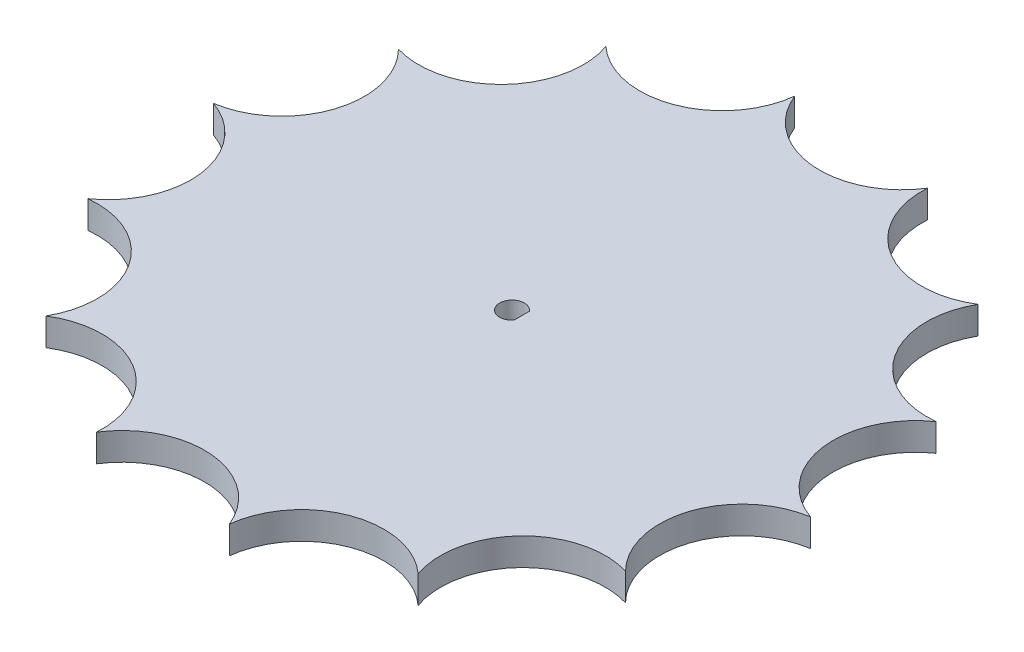
ISO-10303-21;
HEADER;
FILE_DESCRIPTION(('STEP AP214'),'2;1');
FILE_NAME('part.step','',(''),(''),'','','');
FILE_SCHEMA(('AUTOMOTIVE_DESIGN { 1 0 10303 214 1 1 1 1 }'));
ENDSEC;
DATA;
#1=APPLICATION_CONTEXT('core data for automotive mechanical design processes');
#2=APPLICATION_PROTOCOL_DEFINITION('international standard','automotive_design',2000,#1);
#3=PRODUCT_CONTEXT('',#1,'mechanical');
#4=PRODUCT('Part','Part','',(#3));
#5=PRODUCT_RELATED_PRODUCT_CATEGORY('part','',(#4));
#6=PRODUCT_DEFINITION_FORMATION('','',#4);
#7=PRODUCT_DEFINITION_CONTEXT('part definition',#1,'design');
#8=PRODUCT_DEFINITION('design','',#6,#7);
#9=PRODUCT_DEFINITION_SHAPE('','',#8);
#10=(LENGTH_UNIT() NAMED_UNIT(*) SI_UNIT(.MILLI.,.METRE.));
#11=(NAMED_UNIT(*) PLANE_ANGLE_UNIT() SI_UNIT($,.RADIAN.));
#12=(NAMED_UNIT(*) SI_UNIT($,.STERADIAN.) SOLID_ANGLE_UNIT());
#13=UNCERTAINTY_MEASURE_WITH_UNIT(LENGTH_MEASURE(1.E-05),#10,'distance_accuracy_value','');
#14=(GEOMETRIC_REPRESENTATION_CONTEXT(3) GLOBAL_UNCERTAINTY_ASSIGNED_CONTEXT((#13)) GLOBAL_UNIT_ASSIGNED_CONTEXT((#10,
#11,#12)) REPRESENTATION_CONTEXT('',''));
#15=CARTESIAN_POINT('',(0.,0.,0.));
#16=DIRECTION('',(0.,0.,1.));
#17=DIRECTION('',(1.,0.,0.));
#18=AXIS2_PLACEMENT_3D('',#15,#16,#17);
#19=CARTESIAN_POINT('',(0.,0.,0.));
#20=DIRECTION('',(0.,1.,0.));
#21=DIRECTION('',(0.,0.,1.));
#22=AXIS2_PLACEMENT_3D('',#19,#20,#21);
#23=PLANE('',#22);
#24=CARTESIAN_POINT('',(0.,0.,0.));
#25=DIRECTION('',(0.,1.,0.));
#26=DIRECTION('',(0.,0.,1.));
#27=AXIS2_PLACEMENT_3D('',#24,#25,#26);
#28=CIRCLE('',#27,8.255);
#29=CARTESIAN_POINT('',(0.,0.,8.255));
#30=VERTEX_POINT('',#29);
#31=EDGE_CURVE('E51',#30,#30,#28,.T.);
#32=ORIENTED_EDGE('',*,*,#31,.F.);
#33=EDGE_LOOP('',(#32));
#34=FACE_BOUND('',#33,.T.);
#35=CARTESIAN_POINT('',(0.,0.,0.));
#36=DIRECTION('',(0.,1.,0.));
#37=DIRECTION('',(0.,0.,1.));
#38=AXIS2_PLACEMENT_3D('',#35,#36,#37);
#39=CIRCLE('',#38,2.85749999999999);
#40=CARTESIAN_POINT('',(2.23696719913368,0.,-1.778));
#41=VERTEX_POINT('',#40);
#42=CARTESIAN_POINT('',(2.23696719913368,0.,1.778));
#43=VERTEX_POINT('',#42);
#44=EDGE_CURVE('E63',#41,#43,#39,.T.);
#45=ORIENTED_EDGE('',*,*,#44,.T.);
#46=DIRECTION('',(0.,0.,-1.));
#47=VECTOR('',#46,1.);
#48=CARTESIAN_POINT('',(2.23696719913368,0.,1.778));
#49=LINE('',#48,#47);
#50=EDGE_CURVE('E70',#43,#41,#49,.T.);
#51=ORIENTED_EDGE('',*,*,#50,.T.);
#52=EDGE_LOOP('',(#45,#51));
#53=FACE_BOUND('',#52,.T.);
#54=ADVANCED_FACE('F47',(#34,#53),#23,.F.);
#55=CARTESIAN_POINT('',(0.,4.572,0.));
#56=DIRECTION('',(0.,-1.,0.));
#57=DIRECTION('',(0.,0.,-1.));
#58=AXIS2_PLACEMENT_3D('',#55,#56,#57);
#59=CYLINDRICAL_SURFACE('',#58,8.255);
#60=CARTESIAN_POINT('',(0.,4.572,0.));
#61=DIRECTION('',(0.,1.,0.));
#62=DIRECTION('',(0.,0.,1.));
#63=AXIS2_PLACEMENT_3D('',#60,#61,#62);
#64=CIRCLE('',#63,8.255);
#65=CARTESIAN_POINT('',(0.,4.572,8.255));
#66=VERTEX_POINT('',#65);
#67=EDGE_CURVE('E11',#66,#66,#64,.T.);
#68=ORIENTED_EDGE('',*,*,#67,.F.);
#69=EDGE_LOOP('',(#68));
#70=FACE_BOUND('',#69,.T.);
#71=ORIENTED_EDGE('',*,*,#31,.T.);
#72=EDGE_LOOP('',(#71));
#73=FACE_BOUND('',#72,.T.);
#74=ADVANCED_FACE('F49',(#70,#73),#59,.T.);
#75=CARTESIAN_POINT('',(0.,4.572,0.));
#76=DIRECTION('',(0.,-1.,0.));
#77=DIRECTION('',(0.,0.,-1.));
#78=AXIS2_PLACEMENT_3D('',#75,#76,#77);
#79=CYLINDRICAL_SURFACE('',#78,2.85749999999999);
#80=ORIENTED_EDGE('',*,*,#44,.F.);
#81=DIRECTION('',(0.,-1.,0.));
#82=VECTOR('',#81,1.);
#83=CARTESIAN_POINT('',(2.23696719913368,4.572,-1.778));
#84=LINE('',#83,#82);
#85=CARTESIAN_POINT('',(2.23696719913368,10.922,-1.778));
#86=VERTEX_POINT('',#85);
#87=EDGE_CURVE('E339',#86,#41,#84,.T.);
#88=ORIENTED_EDGE('',*,*,#87,.F.);
#89=CARTESIAN_POINT('',(0.,10.922,0.));
#90=DIRECTION('',(0.,1.,0.));
#91=DIRECTION('',(0.,0.,1.));
#92=AXIS2_PLACEMENT_3D('',#89,#90,#91);
#93=CIRCLE('',#92,2.85749999999999);
#94=CARTESIAN_POINT('',(2.23696719913368,10.922,1.778));
#95=VERTEX_POINT('',#94);
#96=EDGE_CURVE('E237',#95,#86,#93,.F.);
#97=ORIENTED_EDGE('',*,*,#96,.F.);
#98=DIRECTION('',(0.,-1.,0.));
#99=VECTOR('',#98,1.);
#100=CARTESIAN_POINT('',(2.23696719913368,4.572,1.778));
#101=LINE('',#100,#99);
#102=EDGE_CURVE('E342',#95,#43,#101,.T.);
#103=ORIENTED_EDGE('',*,*,#102,.T.);
#104=EDGE_LOOP('',(#80,#88,#97,#103));
#105=FACE_BOUND('',#104,.T.);
#106=ADVANCED_FACE('F355',(#105),#79,.F.);
#107=CARTESIAN_POINT('',(2.23696719913368,4.572,1.778));
#108=DIRECTION('',(-1.,0.,0.));
#109=DIRECTION('',(0.,0.,1.));
#110=AXIS2_PLACEMENT_3D('',#107,#108,#109);
#111=PLANE('',#110);
#112=ORIENTED_EDGE('',*,*,#50,.F.);
#113=ORIENTED_EDGE('',*,*,#102,.F.);
#114=DIRECTION('',(0.,0.,1.));
#115=VECTOR('',#114,1.);
#116=CARTESIAN_POINT('',(2.23696719913368,10.922,0.));
#117=LINE('',#116,#115);
#118=EDGE_CURVE('E241',#86,#95,#117,.T.);
#119=ORIENTED_EDGE('',*,*,#118,.F.);
#120=ORIENTED_EDGE('',*,*,#87,.T.);
#121=EDGE_LOOP('',(#112,#113,#119,#120));
#122=FACE_BOUND('',#121,.T.);
#123=ADVANCED_FACE('F360',(#122),#111,.T.);
#124=CARTESIAN_POINT('',(69.2824702056227,10.922,-45.6548487398387));
#125=DIRECTION('',(0.,-1.,0.));
#126=DIRECTION('',(0.,0.,-1.));
#127=AXIS2_PLACEMENT_3D('',#124,#125,#126);
#128=CYLINDRICAL_SURFACE('',#127,19.05);
#129=CARTESIAN_POINT('',(69.2824702056227,4.572,-45.6548487398387));
#130=DIRECTION('',(0.,1.,0.));
#131=DIRECTION('',(0.,0.,1.));
#132=AXIS2_PLACEMENT_3D('',#129,#130,#131);
#133=CIRCLE('',#132,19.05);
#134=CARTESIAN_POINT('',(52.702229315547,4.572,-55.0355796296497));
#135=VERTEX_POINT('',#134);
#136=CARTESIAN_POINT('',(71.3621109565765,4.572,-26.7187035580183));
#137=VERTEX_POINT('',#136);
#138=EDGE_CURVE('E167',#135,#137,#133,.T.);
#139=ORIENTED_EDGE('',*,*,#138,.F.);
#140=DIRECTION('',(0.,-1.,0.));
#141=VECTOR('',#140,1.);
#142=CARTESIAN_POINT('',(52.702229315547,10.922,-55.0355796296497));
#143=LINE('',#142,#141);
#144=CARTESIAN_POINT('',(52.702229315547,10.922,-55.0355796296497));
#145=VERTEX_POINT('',#144);
#146=EDGE_CURVE('E161',#145,#135,#143,.T.);
#147=ORIENTED_EDGE('',*,*,#146,.F.);
#148=CARTESIAN_POINT('',(69.2824702056227,10.922,-45.6548487398387));
#149=DIRECTION('',(0.,1.,0.));
#150=DIRECTION('',(0.,0.,1.));
#151=AXIS2_PLACEMENT_3D('',#148,#149,#150);
#152=CIRCLE('',#151,19.05);
#153=CARTESIAN_POINT('',(71.3621109565765,10.922,-26.7187035580183));
#154=VERTEX_POINT('',#153);
#155=EDGE_CURVE('E164',#145,#154,#152,.T.);
#156=ORIENTED_EDGE('',*,*,#155,.T.);
#157=DIRECTION('',(0.,-1.,0.));
#158=VECTOR('',#157,1.);
#159=CARTESIAN_POINT('',(71.3621109565765,10.922,-26.7187035580183));
#160=LINE('',#159,#158);
#161=EDGE_CURVE('E245',#154,#137,#160,.T.);
#162=ORIENTED_EDGE('',*,*,#161,.T.);
#163=EDGE_LOOP('',(#139,#147,#156,#162));
#164=FACE_BOUND('',#163,.T.);
#165=ADVANCED_FACE('F163',(#164),#128,.F.);
#166=CARTESIAN_POINT('',(42.6124522665552,10.922,-71.194134611505));
#167=DIRECTION('',(0.,-1.,0.));
#168=DIRECTION('',(0.,0.,-1.));
#169=AXIS2_PLACEMENT_3D('',#166,#167,#168);
#170=CYLINDRICAL_SURFACE('',#169,19.05);
#171=CARTESIAN_POINT('',(42.6124522665552,4.572,-71.194134611505));
#172=DIRECTION('',(0.,1.,0.));
#173=DIRECTION('',(0.,0.,1.));
#174=AXIS2_PLACEMENT_3D('',#171,#172,#173);
#175=CIRCLE('',#174,19.05);
#176=CARTESIAN_POINT('',(23.6040248081474,4.572,-72.4519841885394));
#177=VERTEX_POINT('',#176);
#178=EDGE_CURVE('E248',#177,#135,#175,.T.);
#179=ORIENTED_EDGE('',*,*,#178,.F.);
#180=DIRECTION('',(0.,-1.,0.));
#181=VECTOR('',#180,1.);
#182=CARTESIAN_POINT('',(23.6040248081474,10.922,-72.4519841885394));
#183=LINE('',#182,#181);
#184=CARTESIAN_POINT('',(23.6040248081474,10.922,-72.4519841885394));
#185=VERTEX_POINT('',#184);
#186=EDGE_CURVE('E173',#185,#177,#183,.T.);
#187=ORIENTED_EDGE('',*,*,#186,.F.);
#188=CARTESIAN_POINT('',(42.6124522665552,10.922,-71.194134611505));
#189=DIRECTION('',(0.,1.,0.));
#190=DIRECTION('',(0.,0.,1.));
#191=AXIS2_PLACEMENT_3D('',#188,#189,#190);
#192=CIRCLE('',#191,19.05);
#193=EDGE_CURVE('E180',#185,#145,#192,.T.);
#194=ORIENTED_EDGE('',*,*,#193,.T.);
#195=ORIENTED_EDGE('',*,*,#146,.T.);
#196=EDGE_LOOP('',(#179,#187,#194,#195));
#197=FACE_BOUND('',#196,.T.);
#198=ADVANCED_FACE('F188',(#197),#170,.F.);
#199=CARTESIAN_POINT('',(7.50251554866557,10.922,-82.6325489846016));
#200=DIRECTION('',(0.,-1.,0.));
#201=DIRECTION('',(0.,0.,-1.));
#202=AXIS2_PLACEMENT_3D('',#199,#200,#201);
#203=CYLINDRICAL_SURFACE('',#202,19.05);
#204=CARTESIAN_POINT('',(7.50251554866557,4.572,-82.6325489846016));
#205=DIRECTION('',(0.,1.,0.));
#206=DIRECTION('',(0.,0.,1.));
#207=AXIS2_PLACEMENT_3D('',#204,#205,#206);
#208=CIRCLE('',#207,19.05);
#209=CARTESIAN_POINT('',(-10.1692462968725,4.572,-75.5183847136149));
#210=VERTEX_POINT('',#209);
#211=EDGE_CURVE('E251',#210,#177,#208,.T.);
#212=ORIENTED_EDGE('',*,*,#211,.F.);
#213=DIRECTION('',(0.,-1.,0.));
#214=VECTOR('',#213,1.);
#215=CARTESIAN_POINT('',(-10.1692462968725,10.922,-75.5183847136149));
#216=LINE('',#215,#214);
#217=CARTESIAN_POINT('',(-10.1692462968725,10.922,-75.5183847136149));
#218=VERTEX_POINT('',#217);
#219=EDGE_CURVE('E330',#218,#210,#216,.T.);
#220=ORIENTED_EDGE('',*,*,#219,.F.);
#221=CARTESIAN_POINT('',(7.50251554866557,10.922,-82.6325489846016));
#222=DIRECTION('',(0.,1.,0.));
#223=DIRECTION('',(0.,0.,1.));
#224=AXIS2_PLACEMENT_3D('',#221,#222,#223);
#225=CIRCLE('',#224,19.05);
#226=EDGE_CURVE('E190',#218,#185,#225,.T.);
#227=ORIENTED_EDGE('',*,*,#226,.T.);
#228=ORIENTED_EDGE('',*,*,#186,.T.);
#229=EDGE_LOOP('',(#212,#220,#227,#228));
#230=FACE_BOUND('',#229,.T.);
#231=ADVANCED_FACE('F367',(#230),#203,.F.);
#232=CARTESIAN_POINT('',(-29.0933863859522,10.922,-77.7045736095903));
#233=DIRECTION('',(0.,-1.,0.));
#234=DIRECTION('',(0.,0.,-1.));
#235=AXIS2_PLACEMENT_3D('',#232,#233,#234);
#236=CYLINDRICAL_SURFACE('',#235,19.05);
#237=CARTESIAN_POINT('',(-29.0933863859522,4.572,-77.7045736095903));
#238=DIRECTION('',(0.,1.,0.));
#239=DIRECTION('',(0.,0.,1.));
#240=AXIS2_PLACEMENT_3D('',#237,#238,#239);
#241=CIRCLE('',#240,19.05);
#242=CARTESIAN_POINT('',(-41.9283734551748,4.572,-63.6274429739511));
#243=VERTEX_POINT('',#242);
#244=EDGE_CURVE('E255',#243,#210,#241,.T.);
#245=ORIENTED_EDGE('',*,*,#244,.F.);
#246=DIRECTION('',(0.,-1.,0.));
#247=VECTOR('',#246,1.);
#248=CARTESIAN_POINT('',(-41.9283734551748,10.922,-63.6274429739511));
#249=LINE('',#248,#247);
#250=CARTESIAN_POINT('',(-41.9283734551748,10.922,-63.6274429739511));
#251=VERTEX_POINT('',#250);
#252=EDGE_CURVE('E327',#251,#243,#249,.T.);
#253=ORIENTED_EDGE('',*,*,#252,.F.);
#254=CARTESIAN_POINT('',(-29.0933863859522,10.922,-77.7045736095903));
#255=DIRECTION('',(0.,1.,0.));
#256=DIRECTION('',(0.,0.,1.));
#257=AXIS2_PLACEMENT_3D('',#254,#255,#256);
#258=CIRCLE('',#257,19.05);
#259=EDGE_CURVE('E193',#251,#218,#258,.T.);
#260=ORIENTED_EDGE('',*,*,#259,.T.);
#261=ORIENTED_EDGE('',*,*,#219,.T.);
#262=EDGE_LOOP('',(#245,#253,#260,#261));
#263=FACE_BOUND('',#262,.T.);
#264=ADVANCED_FACE('F370',(#263),#236,.F.);
#265=CARTESIAN_POINT('',(-59.9269863398636,10.922,-57.386254447144));
#266=DIRECTION('',(0.,-1.,0.));
#267=DIRECTION('',(0.,0.,-1.));
#268=AXIS2_PLACEMENT_3D('',#265,#266,#267);
#269=CYLINDRICAL_SURFACE('',#268,19.05);
#270=CARTESIAN_POINT('',(-59.9269863398636,4.572,-57.386254447144));
#271=DIRECTION('',(0.,1.,0.));
#272=DIRECTION('',(0.,0.,1.));
#273=AXIS2_PLACEMENT_3D('',#270,#271,#272);
#274=CIRCLE('',#273,19.05);
#275=CARTESIAN_POINT('',(-65.3830720329258,4.572,-39.1343058139177));
#276=VERTEX_POINT('',#275);
#277=EDGE_CURVE('E259',#276,#243,#274,.T.);
#278=ORIENTED_EDGE('',*,*,#277,.F.);
#279=DIRECTION('',(0.,-1.,0.));
#280=VECTOR('',#279,1.);
#281=CARTESIAN_POINT('',(-65.3830720329258,10.922,-39.1343058139177));
#282=LINE('',#281,#280);
#283=CARTESIAN_POINT('',(-65.3830720329258,10.922,-39.1343058139177));
#284=VERTEX_POINT('',#283);
#285=EDGE_CURVE('E324',#284,#276,#282,.T.);
#286=ORIENTED_EDGE('',*,*,#285,.F.);
#287=CARTESIAN_POINT('',(-59.9269863398636,10.922,-57.386254447144));
#288=DIRECTION('',(0.,1.,0.));
#289=DIRECTION('',(0.,0.,1.));
#290=AXIS2_PLACEMENT_3D('',#287,#288,#289);
#291=CIRCLE('',#290,19.05);
#292=EDGE_CURVE('E199',#284,#251,#291,.T.);
#293=ORIENTED_EDGE('',*,*,#292,.T.);
#294=ORIENTED_EDGE('',*,*,#252,.T.);
#295=EDGE_LOOP('',(#278,#286,#293,#294));
#296=FACE_BOUND('',#295,.T.);
#297=ADVANCED_FACE('F374',(#296),#269,.F.);
#298=CARTESIAN_POINT('',(-78.891311692909,10.922,-25.7018837952166));
#299=DIRECTION('',(0.,-1.,0.));
#300=DIRECTION('',(0.,0.,-1.));
#301=AXIS2_PLACEMENT_3D('',#298,#299,#300);
#302=CYLINDRICAL_SURFACE('',#301,19.05);
#303=CARTESIAN_POINT('',(-78.891311692909,4.572,-25.7018837952166));
#304=DIRECTION('',(0.,1.,0.));
#305=DIRECTION('',(0.,0.,1.));
#306=AXIS2_PLACEMENT_3D('',#303,#304,#305);
#307=CIRCLE('',#306,19.05);
#308=CARTESIAN_POINT('',(-75.8878513238001,4.572,-6.89013943667396));
#309=VERTEX_POINT('',#308);
#310=EDGE_CURVE('E263',#309,#276,#307,.T.);
#311=ORIENTED_EDGE('',*,*,#310,.F.);
#312=DIRECTION('',(0.,-1.,0.));
#313=VECTOR('',#312,1.);
#314=CARTESIAN_POINT('',(-75.8878513238001,10.922,-6.89013943667396));
#315=LINE('',#314,#313);
#316=CARTESIAN_POINT('',(-75.8878513238001,10.922,-6.89013943667396));
#317=VERTEX_POINT('',#316);
#318=EDGE_CURVE('E321',#317,#309,#315,.T.);
#319=ORIENTED_EDGE('',*,*,#318,.F.);
#320=CARTESIAN_POINT('',(-78.891311692909,10.922,-25.7018837952166));
#321=DIRECTION('',(0.,1.,0.));
#322=DIRECTION('',(0.,0.,1.));
#323=AXIS2_PLACEMENT_3D('',#320,#321,#322);
#324=CIRCLE('',#323,19.05);
#325=EDGE_CURVE('E203',#317,#284,#324,.T.);
#326=ORIENTED_EDGE('',*,*,#325,.T.);
#327=ORIENTED_EDGE('',*,*,#285,.T.);
#328=EDGE_LOOP('',(#311,#319,#326,#327));
#329=FACE_BOUND('',#328,.T.);
#330=ADVANCED_FACE('F378',(#329),#302,.F.);
#331=CARTESIAN_POINT('',(-82.2302452267307,10.922,11.0730601552723));
#332=DIRECTION('',(0.,-1.,0.));
#333=DIRECTION('',(0.,0.,-1.));
#334=AXIS2_PLACEMENT_3D('',#331,#332,#333);
#335=CYLINDRICAL_SURFACE('',#334,19.05);
#336=CARTESIAN_POINT('',(-82.2302452267307,4.572,11.0730601552723));
#337=DIRECTION('',(0.,1.,0.));
#338=DIRECTION('',(0.,0.,1.));
#339=AXIS2_PLACEMENT_3D('',#336,#337,#338);
#340=CIRCLE('',#339,19.05);
#341=CARTESIAN_POINT('',(-71.3621109565767,4.572,26.7187035580178));
#342=VERTEX_POINT('',#341);
#343=EDGE_CURVE('E267',#342,#309,#340,.T.);
#344=ORIENTED_EDGE('',*,*,#343,.F.);
#345=DIRECTION('',(0.,-1.,0.));
#346=VECTOR('',#345,1.);
#347=CARTESIAN_POINT('',(-71.3621109565767,10.922,26.7187035580178));
#348=LINE('',#347,#346);
#349=CARTESIAN_POINT('',(-71.3621109565767,10.922,26.7187035580178));
#350=VERTEX_POINT('',#349);
#351=EDGE_CURVE('E318',#350,#342,#348,.T.);
#352=ORIENTED_EDGE('',*,*,#351,.F.);
#353=CARTESIAN_POINT('',(-82.2302452267307,10.922,11.0730601552723));
#354=DIRECTION('',(0.,1.,0.));
#355=DIRECTION('',(0.,0.,1.));
#356=AXIS2_PLACEMENT_3D('',#353,#354,#355);
#357=CIRCLE('',#356,19.05);
#358=EDGE_CURVE('E207',#350,#317,#357,.T.);
#359=ORIENTED_EDGE('',*,*,#358,.T.);
#360=ORIENTED_EDGE('',*,*,#318,.T.);
#361=EDGE_LOOP('',(#344,#352,#359,#360));
#362=FACE_BOUND('',#361,.T.);
#363=ADVANCED_FACE('F382',(#362),#335,.F.);
#364=CARTESIAN_POINT('',(-69.2824702056227,10.922,45.6548487398387));
#365=DIRECTION('',(0.,-1.,0.));
#366=DIRECTION('',(0.,0.,-1.));
#367=AXIS2_PLACEMENT_3D('',#364,#365,#366);
#368=CYLINDRICAL_SURFACE('',#367,19.05);
#369=CARTESIAN_POINT('',(-69.2824702056227,4.572,45.6548487398387));
#370=DIRECTION('',(0.,1.,0.));
#371=DIRECTION('',(0.,0.,1.));
#372=AXIS2_PLACEMENT_3D('',#369,#370,#371);
#373=CIRCLE('',#372,19.05);
#374=CARTESIAN_POINT('',(-52.7022293155473,4.572,55.0355796296493));
#375=VERTEX_POINT('',#374);
#376=EDGE_CURVE('E271',#375,#342,#373,.T.);
#377=ORIENTED_EDGE('',*,*,#376,.F.);
#378=DIRECTION('',(0.,-1.,0.));
#379=VECTOR('',#378,1.);
#380=CARTESIAN_POINT('',(-52.7022293155473,10.922,55.0355796296493));
#381=LINE('',#380,#379);
#382=CARTESIAN_POINT('',(-52.7022293155473,10.922,55.0355796296493));
#383=VERTEX_POINT('',#382);
#384=EDGE_CURVE('E315',#383,#375,#381,.T.);
#385=ORIENTED_EDGE('',*,*,#384,.F.);
#386=CARTESIAN_POINT('',(-69.2824702056227,10.922,45.6548487398387));
#387=DIRECTION('',(0.,1.,0.));
#388=DIRECTION('',(0.,0.,1.));
#389=AXIS2_PLACEMENT_3D('',#386,#387,#388);
#390=CIRCLE('',#389,19.05);
#391=EDGE_CURVE('E211',#383,#350,#390,.T.);
#392=ORIENTED_EDGE('',*,*,#391,.T.);
#393=ORIENTED_EDGE('',*,*,#351,.T.);
#394=EDGE_LOOP('',(#377,#385,#392,#393));
#395=FACE_BOUND('',#394,.T.);
#396=ADVANCED_FACE('F386',(#395),#368,.F.);
#397=CARTESIAN_POINT('',(-42.6124522665552,10.922,71.194134611505));
#398=DIRECTION('',(0.,-1.,0.));
#399=DIRECTION('',(0.,0.,-1.));
#400=AXIS2_PLACEMENT_3D('',#397,#398,#399);
#401=CYLINDRICAL_SURFACE('',#400,19.05);
#402=CARTESIAN_POINT('',(-42.6124522665552,4.572,71.194134611505));
#403=DIRECTION('',(0.,1.,0.));
#404=DIRECTION('',(0.,0.,1.));
#405=AXIS2_PLACEMENT_3D('',#402,#403,#404);
#406=CIRCLE('',#405,19.05);
#407=CARTESIAN_POINT('',(-23.6040248081479,4.572,72.4519841885392));
#408=VERTEX_POINT('',#407);
#409=EDGE_CURVE('E275',#408,#375,#406,.T.);
#410=ORIENTED_EDGE('',*,*,#409,.F.);
#411=DIRECTION('',(0.,-1.,0.));
#412=VECTOR('',#411,1.);
#413=CARTESIAN_POINT('',(-23.6040248081479,10.922,72.4519841885392));
#414=LINE('',#413,#412);
#415=CARTESIAN_POINT('',(-23.6040248081479,10.922,72.4519841885392));
#416=VERTEX_POINT('',#415);
#417=EDGE_CURVE('E312',#416,#408,#414,.T.);
#418=ORIENTED_EDGE('',*,*,#417,.F.);
#419=CARTESIAN_POINT('',(-42.6124522665552,10.922,71.194134611505));
#420=DIRECTION('',(0.,1.,0.));
#421=DIRECTION('',(0.,0.,1.));
#422=AXIS2_PLACEMENT_3D('',#419,#420,#421);
#423=CIRCLE('',#422,19.05);
#424=EDGE_CURVE('E215',#416,#383,#423,.T.);
#425=ORIENTED_EDGE('',*,*,#424,.T.);
#426=ORIENTED_EDGE('',*,*,#384,.T.);
#427=EDGE_LOOP('',(#410,#418,#425,#426));
#428=FACE_BOUND('',#427,.T.);
#429=ADVANCED_FACE('F390',(#428),#401,.F.);
#430=CARTESIAN_POINT('',(-7.50251554866554,10.922,82.6325489846016));
#431=DIRECTION('',(0.,-1.,0.));
#432=DIRECTION('',(0.,0.,-1.));
#433=AXIS2_PLACEMENT_3D('',#430,#431,#432);
#434=CYLINDRICAL_SURFACE('',#433,19.05);
#435=CARTESIAN_POINT('',(-7.50251554866554,4.572,82.6325489846016));
#436=DIRECTION('',(0.,1.,0.));
#437=DIRECTION('',(0.,0.,1.));
#438=AXIS2_PLACEMENT_3D('',#435,#436,#437);
#439=CIRCLE('',#438,19.05);
#440=CARTESIAN_POINT('',(10.169246296872,4.572,75.5183847136149));
#441=VERTEX_POINT('',#440);
#442=EDGE_CURVE('E279',#441,#408,#439,.T.);
#443=ORIENTED_EDGE('',*,*,#442,.F.);
#444=DIRECTION('',(0.,-1.,0.));
#445=VECTOR('',#444,1.);
#446=CARTESIAN_POINT('',(10.169246296872,10.922,75.5183847136149));
#447=LINE('',#446,#445);
#448=CARTESIAN_POINT('',(10.169246296872,10.922,75.5183847136149));
#449=VERTEX_POINT('',#448);
#450=EDGE_CURVE('E309',#449,#441,#447,.T.);
#451=ORIENTED_EDGE('',*,*,#450,.F.);
#452=CARTESIAN_POINT('',(-7.50251554866554,10.922,82.6325489846016));
#453=DIRECTION('',(0.,1.,0.));
#454=DIRECTION('',(0.,0.,1.));
#455=AXIS2_PLACEMENT_3D('',#452,#453,#454);
#456=CIRCLE('',#455,19.05);
#457=EDGE_CURVE('E219',#449,#416,#456,.T.);
#458=ORIENTED_EDGE('',*,*,#457,.T.);
#459=ORIENTED_EDGE('',*,*,#417,.T.);
#460=EDGE_LOOP('',(#443,#451,#458,#459));
#461=FACE_BOUND('',#460,.T.);
#462=ADVANCED_FACE('F394',(#461),#434,.F.);
#463=CARTESIAN_POINT('',(29.0933863859522,10.922,77.7045736095903));
#464=DIRECTION('',(0.,-1.,0.));
#465=DIRECTION('',(0.,0.,-1.));
#466=AXIS2_PLACEMENT_3D('',#463,#464,#465);
#467=CYLINDRICAL_SURFACE('',#466,19.05);
#468=CARTESIAN_POINT('',(29.0933863859522,4.572,77.7045736095903));
#469=DIRECTION('',(0.,1.,0.));
#470=DIRECTION('',(0.,0.,1.));
#471=AXIS2_PLACEMENT_3D('',#468,#469,#470);
#472=CIRCLE('',#471,19.05);
#473=CARTESIAN_POINT('',(41.9283734551752,4.572,63.6274429739508));
#474=VERTEX_POINT('',#473);
#475=EDGE_CURVE('E283',#474,#441,#472,.T.);
#476=ORIENTED_EDGE('',*,*,#475,.F.);
#477=DIRECTION('',(0.,-1.,0.));
#478=VECTOR('',#477,1.);
#479=CARTESIAN_POINT('',(41.9283734551752,10.922,63.6274429739508));
#480=LINE('',#479,#478);
#481=CARTESIAN_POINT('',(41.9283734551752,10.922,63.6274429739508));
#482=VERTEX_POINT('',#481);
#483=EDGE_CURVE('E306',#482,#474,#480,.T.);
#484=ORIENTED_EDGE('',*,*,#483,.F.);
#485=CARTESIAN_POINT('',(29.0933863859522,10.922,77.7045736095903));
#486=DIRECTION('',(0.,1.,0.));
#487=DIRECTION('',(0.,0.,1.));
#488=AXIS2_PLACEMENT_3D('',#485,#486,#487);
#489=CIRCLE('',#488,19.05);
#490=EDGE_CURVE('E223',#482,#449,#489,.T.);
#491=ORIENTED_EDGE('',*,*,#490,.T.);
#492=ORIENTED_EDGE('',*,*,#450,.T.);
#493=EDGE_LOOP('',(#476,#484,#491,#492));
#494=FACE_BOUND('',#493,.T.);
#495=ADVANCED_FACE('F398',(#494),#467,.F.);
#496=CARTESIAN_POINT('',(59.9269863398636,10.922,57.386254447144));
#497=DIRECTION('',(0.,-1.,0.));
#498=DIRECTION('',(0.,0.,-1.));
#499=AXIS2_PLACEMENT_3D('',#496,#497,#498);
#500=CYLINDRICAL_SURFACE('',#499,19.05);
#501=CARTESIAN_POINT('',(59.9269863398636,4.572,57.386254447144));
#502=DIRECTION('',(0.,1.,0.));
#503=DIRECTION('',(0.,0.,1.));
#504=AXIS2_PLACEMENT_3D('',#501,#502,#503);
#505=CIRCLE('',#504,19.05);
#506=CARTESIAN_POINT('',(65.3830720329261,4.572,39.1343058139173));
#507=VERTEX_POINT('',#506);
#508=EDGE_CURVE('E287',#507,#474,#505,.T.);
#509=ORIENTED_EDGE('',*,*,#508,.F.);
#510=DIRECTION('',(0.,-1.,0.));
#511=VECTOR('',#510,1.);
#512=CARTESIAN_POINT('',(65.3830720329261,10.922,39.1343058139173));
#513=LINE('',#512,#511);
#514=CARTESIAN_POINT('',(65.3830720329261,10.922,39.1343058139173));
#515=VERTEX_POINT('',#514);
#516=EDGE_CURVE('E303',#515,#507,#513,.T.);
#517=ORIENTED_EDGE('',*,*,#516,.F.);
#518=CARTESIAN_POINT('',(59.9269863398636,10.922,57.386254447144));
#519=DIRECTION('',(0.,1.,0.));
#520=DIRECTION('',(0.,0.,1.));
#521=AXIS2_PLACEMENT_3D('',#518,#519,#520);
#522=CIRCLE('',#521,19.05);
#523=EDGE_CURVE('E227',#515,#482,#522,.T.);
#524=ORIENTED_EDGE('',*,*,#523,.T.);
#525=ORIENTED_EDGE('',*,*,#483,.T.);
#526=EDGE_LOOP('',(#509,#517,#524,#525));
#527=FACE_BOUND('',#526,.T.);
#528=ADVANCED_FACE('F402',(#527),#500,.F.);
#529=CARTESIAN_POINT('',(78.8913116929091,10.922,25.7018837952166));
#530=DIRECTION('',(0.,-1.,0.));
#531=DIRECTION('',(0.,0.,-1.));
#532=AXIS2_PLACEMENT_3D('',#529,#530,#531);
#533=CYLINDRICAL_SURFACE('',#532,19.05);
#534=CARTESIAN_POINT('',(78.8913116929091,4.572,25.7018837952166));
#535=DIRECTION('',(0.,1.,0.));
#536=DIRECTION('',(0.,0.,1.));
#537=AXIS2_PLACEMENT_3D('',#534,#535,#536);
#538=CIRCLE('',#537,19.05);
#539=CARTESIAN_POINT('',(75.8878513238002,4.572,6.89013943667346));
#540=VERTEX_POINT('',#539);
#541=EDGE_CURVE('E291',#540,#507,#538,.T.);
#542=ORIENTED_EDGE('',*,*,#541,.F.);
#543=DIRECTION('',(0.,-1.,0.));
#544=VECTOR('',#543,1.);
#545=CARTESIAN_POINT('',(75.8878513238002,10.922,6.89013943667346));
#546=LINE('',#545,#544);
#547=CARTESIAN_POINT('',(75.8878513238002,10.922,6.89013943667346));
#548=VERTEX_POINT('',#547);
#549=EDGE_CURVE('E300',#548,#540,#546,.T.);
#550=ORIENTED_EDGE('',*,*,#549,.F.);
#551=CARTESIAN_POINT('',(78.8913116929091,10.922,25.7018837952166));
#552=DIRECTION('',(0.,1.,0.));
#553=DIRECTION('',(0.,0.,1.));
#554=AXIS2_PLACEMENT_3D('',#551,#552,#553);
#555=CIRCLE('',#554,19.05);
#556=EDGE_CURVE('E231',#548,#515,#555,.T.);
#557=ORIENTED_EDGE('',*,*,#556,.T.);
#558=ORIENTED_EDGE('',*,*,#516,.T.);
#559=EDGE_LOOP('',(#542,#550,#557,#558));
#560=FACE_BOUND('',#559,.T.);
#561=ADVANCED_FACE('F406',(#560),#533,.F.);
#562=CARTESIAN_POINT('',(82.2302452267307,10.922,-11.0730601552723));
#563=DIRECTION('',(0.,-1.,0.));
#564=DIRECTION('',(0.,0.,-1.));
#565=AXIS2_PLACEMENT_3D('',#562,#563,#564);
#566=CYLINDRICAL_SURFACE('',#565,19.05);
#567=CARTESIAN_POINT('',(82.2302452267307,4.572,-11.0730601552723));
#568=DIRECTION('',(0.,1.,0.));
#569=DIRECTION('',(0.,0.,1.));
#570=AXIS2_PLACEMENT_3D('',#567,#568,#569);
#571=CIRCLE('',#570,19.05);
#572=EDGE_CURVE('E186',#137,#540,#571,.T.);
#573=ORIENTED_EDGE('',*,*,#572,.F.);
#574=ORIENTED_EDGE('',*,*,#161,.F.);
#575=CARTESIAN_POINT('',(82.2302452267307,10.922,-11.0730601552723));
#576=DIRECTION('',(0.,1.,0.));
#577=DIRECTION('',(0.,0.,1.));
#578=AXIS2_PLACEMENT_3D('',#575,#576,#577);
#579=CIRCLE('',#578,19.05);
#580=EDGE_CURVE('E184',#154,#548,#579,.T.);
#581=ORIENTED_EDGE('',*,*,#580,.T.);
#582=ORIENTED_EDGE('',*,*,#549,.T.);
#583=EDGE_LOOP('',(#573,#574,#581,#582));
#584=FACE_BOUND('',#583,.T.);
#585=ADVANCED_FACE('F410',(#584),#566,.F.);
#586=CARTESIAN_POINT('',(0.,10.922,0.));
#587=DIRECTION('',(0.,1.,0.));
#588=DIRECTION('',(0.,0.,1.));
#589=AXIS2_PLACEMENT_3D('',#586,#587,#588);
#590=PLANE('',#589);
#591=ORIENTED_EDGE('',*,*,#155,.F.);
#592=ORIENTED_EDGE('',*,*,#193,.F.);
#593=ORIENTED_EDGE('',*,*,#226,.F.);
#594=ORIENTED_EDGE('',*,*,#259,.F.);
#595=ORIENTED_EDGE('',*,*,#292,.F.);
#596=ORIENTED_EDGE('',*,*,#325,.F.);
#597=ORIENTED_EDGE('',*,*,#358,.F.);
#598=ORIENTED_EDGE('',*,*,#391,.F.);
#599=ORIENTED_EDGE('',*,*,#424,.F.);
#600=ORIENTED_EDGE('',*,*,#457,.F.);
#601=ORIENTED_EDGE('',*,*,#490,.F.);
#602=ORIENTED_EDGE('',*,*,#523,.F.);
#603=ORIENTED_EDGE('',*,*,#556,.F.);
#604=ORIENTED_EDGE('',*,*,#580,.F.);
#605=EDGE_LOOP('',(#591,#592,#593,#594,#595,#596,#597,#598,#599,#600,#601,#602,#603,#604));
#606=FACE_BOUND('',#605,.T.);
#607=ORIENTED_EDGE('',*,*,#96,.T.);
#608=ORIENTED_EDGE('',*,*,#118,.T.);
#609=EDGE_LOOP('',(#607,#608));
#610=FACE_BOUND('',#609,.T.);
#611=ADVANCED_FACE('F177',(#606,#610),#590,.T.);
#612=CARTESIAN_POINT('',(0.,4.572,0.));
#613=DIRECTION('',(0.,1.,0.));
#614=DIRECTION('',(0.,0.,1.));
#615=AXIS2_PLACEMENT_3D('',#612,#613,#614);
#616=PLANE('',#615);
#617=ORIENTED_EDGE('',*,*,#67,.T.);
#618=EDGE_LOOP('',(#617));
#619=FACE_BOUND('',#618,.T.);
#620=ORIENTED_EDGE('',*,*,#138,.T.);
#621=ORIENTED_EDGE('',*,*,#572,.T.);
#622=ORIENTED_EDGE('',*,*,#541,.T.);
#623=ORIENTED_EDGE('',*,*,#508,.T.);
#624=ORIENTED_EDGE('',*,*,#475,.T.);
#625=ORIENTED_EDGE('',*,*,#442,.T.);
#626=ORIENTED_EDGE('',*,*,#409,.T.);
#627=ORIENTED_EDGE('',*,*,#376,.T.);
#628=ORIENTED_EDGE('',*,*,#343,.T.);
#629=ORIENTED_EDGE('',*,*,#310,.T.);
#630=ORIENTED_EDGE('',*,*,#277,.T.);
#631=ORIENTED_EDGE('',*,*,#244,.T.);
#632=ORIENTED_EDGE('',*,*,#211,.T.);
#633=ORIENTED_EDGE('',*,*,#178,.T.);
#634=EDGE_LOOP('',(#620,#621,#622,#623,#624,#625,#626,#627,#628,#629,#630,#631,#632,#633));
#635=FACE_BOUND('',#634,.T.);
#636=ADVANCED_FACE('F415',(#619,#635),#616,.F.);
#637=CLOSED_SHELL('',(#54,#74,#106,#123,#165,#198,#231,#264,#297,#330,#363,#396,#429,#462,#495,
#528,#561,#585,#611,#636));
#638=MANIFOLD_SOLID_BREP('B2',#637);
#639=ADVANCED_BREP_SHAPE_REPRESENTATION('',(#18,#638),#14);
#640=SHAPE_DEFINITION_REPRESENTATION(#9,#639);
ENDSEC;
END-ISO-10303-21;
